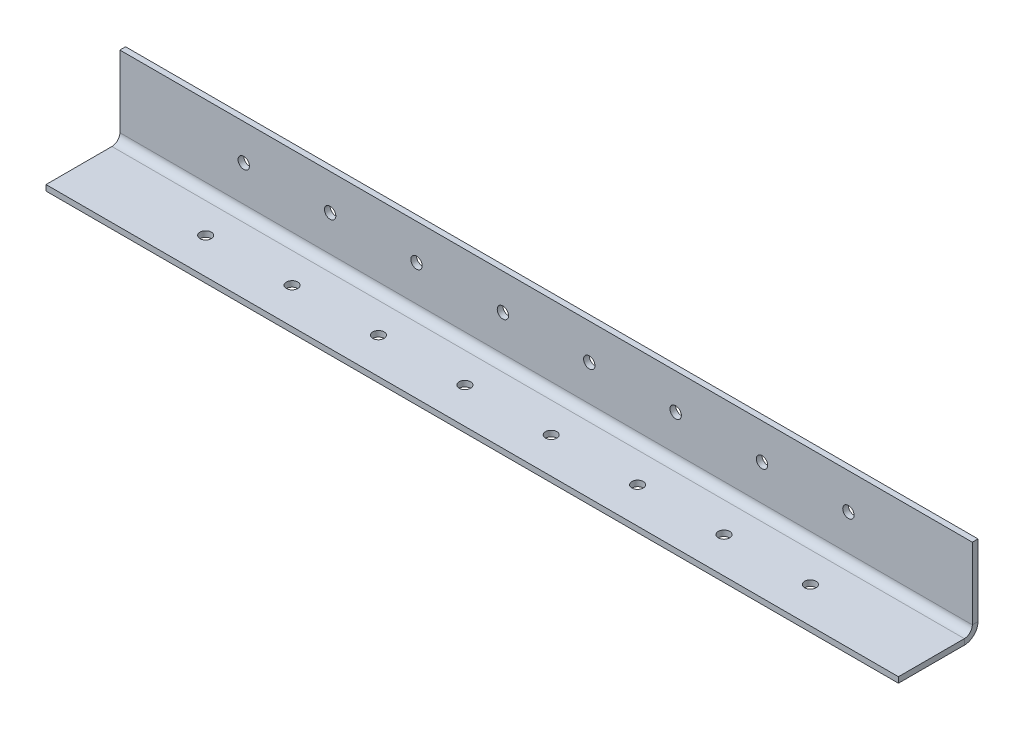
ISO-10303-21;
HEADER;
FILE_DESCRIPTION(('STEP AP214'),'2;1');
FILE_NAME('part.step','',(''),(''),'','','');
FILE_SCHEMA(('AUTOMOTIVE_DESIGN { 1 0 10303 214 1 1 1 1 }'));
ENDSEC;
DATA;
#1=APPLICATION_CONTEXT('core data for automotive mechanical design processes');
#2=APPLICATION_PROTOCOL_DEFINITION('international standard','automotive_design',2000,#1);
#3=PRODUCT_CONTEXT('',#1,'mechanical');
#4=PRODUCT('Part','Part','',(#3));
#5=PRODUCT_RELATED_PRODUCT_CATEGORY('part','',(#4));
#6=PRODUCT_DEFINITION_FORMATION('','',#4);
#7=PRODUCT_DEFINITION_CONTEXT('part definition',#1,'design');
#8=PRODUCT_DEFINITION('design','',#6,#7);
#9=PRODUCT_DEFINITION_SHAPE('','',#8);
#10=(LENGTH_UNIT() NAMED_UNIT(*) SI_UNIT(.MILLI.,.METRE.));
#11=(NAMED_UNIT(*) PLANE_ANGLE_UNIT() SI_UNIT($,.RADIAN.));
#12=(NAMED_UNIT(*) SI_UNIT($,.STERADIAN.) SOLID_ANGLE_UNIT());
#13=UNCERTAINTY_MEASURE_WITH_UNIT(LENGTH_MEASURE(1.E-05),#10,'distance_accuracy_value','');
#14=(GEOMETRIC_REPRESENTATION_CONTEXT(3) GLOBAL_UNCERTAINTY_ASSIGNED_CONTEXT((#13)) GLOBAL_UNIT_ASSIGNED_CONTEXT((#10,
#11,#12)) REPRESENTATION_CONTEXT('',''));
#15=CARTESIAN_POINT('',(0.,0.,0.));
#16=DIRECTION('',(0.,0.,1.));
#17=DIRECTION('',(1.,0.,0.));
#18=AXIS2_PLACEMENT_3D('',#15,#16,#17);
#19=CARTESIAN_POINT('',(531.999999999999,12.,0.));
#20=DIRECTION('',(0.,0.,-1.));
#21=DIRECTION('',(-1.,0.,0.));
#22=AXIS2_PLACEMENT_3D('',#19,#20,#21);
#23=CYLINDRICAL_SURFACE('',#22,10.0000000000001);
#24=CARTESIAN_POINT('',(531.999999999999,12.,0.));
#25=DIRECTION('',(0.,0.,-1.));
#26=DIRECTION('',(-1.,0.,0.));
#27=AXIS2_PLACEMENT_3D('',#24,#25,#26);
#28=CIRCLE('',#27,10.0000000000001);
#29=CARTESIAN_POINT('',(521.999999999999,12.,0.));
#30=VERTEX_POINT('',#29);
#31=EDGE_CURVE('E68',#30,#30,#28,.T.);
#32=ORIENTED_EDGE('',*,*,#31,.F.);
#33=EDGE_LOOP('',(#32));
#34=FACE_BOUND('',#33,.T.);
#35=CARTESIAN_POINT('',(531.999999999999,12.,-10.));
#36=DIRECTION('',(0.,0.,-1.));
#37=DIRECTION('',(-1.,0.,0.));
#38=AXIS2_PLACEMENT_3D('',#35,#36,#37);
#39=CIRCLE('',#38,10.0000000000001);
#40=CARTESIAN_POINT('',(521.999999999999,12.,-10.));
#41=VERTEX_POINT('',#40);
#42=EDGE_CURVE('E13',#41,#41,#39,.T.);
#43=ORIENTED_EDGE('',*,*,#42,.T.);
#44=EDGE_LOOP('',(#43));
#45=FACE_BOUND('',#44,.T.);
#46=ADVANCED_FACE('F60',(#34,#45),#23,.F.);
#47=CARTESIAN_POINT('',(379.999999999999,12.,0.));
#48=DIRECTION('',(0.,0.,-1.));
#49=DIRECTION('',(-1.,0.,0.));
#50=AXIS2_PLACEMENT_3D('',#47,#48,#49);
#51=CYLINDRICAL_SURFACE('',#50,10.0000000000001);
#52=CARTESIAN_POINT('',(379.999999999999,12.,0.));
#53=DIRECTION('',(0.,0.,-1.));
#54=DIRECTION('',(-1.,0.,0.));
#55=AXIS2_PLACEMENT_3D('',#52,#53,#54);
#56=CIRCLE('',#55,10.0000000000001);
#57=CARTESIAN_POINT('',(369.999999999999,12.,0.));
#58=VERTEX_POINT('',#57);
#59=EDGE_CURVE('E164',#58,#58,#56,.T.);
#60=ORIENTED_EDGE('',*,*,#59,.F.);
#61=EDGE_LOOP('',(#60));
#62=FACE_BOUND('',#61,.T.);
#63=CARTESIAN_POINT('',(379.999999999999,12.,-10.));
#64=DIRECTION('',(0.,0.,-1.));
#65=DIRECTION('',(-1.,0.,0.));
#66=AXIS2_PLACEMENT_3D('',#63,#64,#65);
#67=CIRCLE('',#66,10.0000000000001);
#68=CARTESIAN_POINT('',(369.999999999999,12.,-10.));
#69=VERTEX_POINT('',#68);
#70=EDGE_CURVE('E168',#69,#69,#67,.T.);
#71=ORIENTED_EDGE('',*,*,#70,.T.);
#72=EDGE_LOOP('',(#71));
#73=FACE_BOUND('',#72,.T.);
#74=ADVANCED_FACE('F179',(#62,#73),#51,.F.);
#75=CARTESIAN_POINT('',(227.999999999999,12.,0.));
#76=DIRECTION('',(0.,0.,-1.));
#77=DIRECTION('',(-1.,0.,0.));
#78=AXIS2_PLACEMENT_3D('',#75,#76,#77);
#79=CYLINDRICAL_SURFACE('',#78,10.0000000000001);
#80=CARTESIAN_POINT('',(227.999999999999,12.,0.));
#81=DIRECTION('',(0.,0.,-1.));
#82=DIRECTION('',(-1.,0.,0.));
#83=AXIS2_PLACEMENT_3D('',#80,#81,#82);
#84=CIRCLE('',#83,10.0000000000001);
#85=CARTESIAN_POINT('',(217.999999999999,12.,0.));
#86=VERTEX_POINT('',#85);
#87=EDGE_CURVE('E156',#86,#86,#84,.T.);
#88=ORIENTED_EDGE('',*,*,#87,.F.);
#89=EDGE_LOOP('',(#88));
#90=FACE_BOUND('',#89,.T.);
#91=CARTESIAN_POINT('',(227.999999999999,12.,-10.));
#92=DIRECTION('',(0.,0.,-1.));
#93=DIRECTION('',(-1.,0.,0.));
#94=AXIS2_PLACEMENT_3D('',#91,#92,#93);
#95=CIRCLE('',#94,10.0000000000001);
#96=CARTESIAN_POINT('',(217.999999999999,12.,-10.));
#97=VERTEX_POINT('',#96);
#98=EDGE_CURVE('E160',#97,#97,#95,.T.);
#99=ORIENTED_EDGE('',*,*,#98,.T.);
#100=EDGE_LOOP('',(#99));
#101=FACE_BOUND('',#100,.T.);
#102=ADVANCED_FACE('F217',(#90,#101),#79,.F.);
#103=CARTESIAN_POINT('',(75.9999999999993,12.,0.));
#104=DIRECTION('',(0.,0.,-1.));
#105=DIRECTION('',(-1.,0.,0.));
#106=AXIS2_PLACEMENT_3D('',#103,#104,#105);
#107=CYLINDRICAL_SURFACE('',#106,10.0000000000001);
#108=CARTESIAN_POINT('',(75.9999999999993,12.,0.));
#109=DIRECTION('',(0.,0.,-1.));
#110=DIRECTION('',(-1.,0.,0.));
#111=AXIS2_PLACEMENT_3D('',#108,#109,#110);
#112=CIRCLE('',#111,10.0000000000001);
#113=CARTESIAN_POINT('',(65.9999999999992,12.,0.));
#114=VERTEX_POINT('',#113);
#115=EDGE_CURVE('E148',#114,#114,#112,.T.);
#116=ORIENTED_EDGE('',*,*,#115,.F.);
#117=EDGE_LOOP('',(#116));
#118=FACE_BOUND('',#117,.T.);
#119=CARTESIAN_POINT('',(75.9999999999993,12.,-10.));
#120=DIRECTION('',(0.,0.,-1.));
#121=DIRECTION('',(-1.,0.,0.));
#122=AXIS2_PLACEMENT_3D('',#119,#120,#121);
#123=CIRCLE('',#122,10.0000000000001);
#124=CARTESIAN_POINT('',(65.9999999999992,12.,-10.));
#125=VERTEX_POINT('',#124);
#126=EDGE_CURVE('E152',#125,#125,#123,.T.);
#127=ORIENTED_EDGE('',*,*,#126,.T.);
#128=EDGE_LOOP('',(#127));
#129=FACE_BOUND('',#128,.T.);
#130=ADVANCED_FACE('F213',(#118,#129),#107,.F.);
#131=CARTESIAN_POINT('',(-76.0000000000007,12.,0.));
#132=DIRECTION('',(0.,0.,-1.));
#133=DIRECTION('',(-1.,0.,0.));
#134=AXIS2_PLACEMENT_3D('',#131,#132,#133);
#135=CYLINDRICAL_SURFACE('',#134,10.0000000000001);
#136=CARTESIAN_POINT('',(-76.0000000000007,12.,0.));
#137=DIRECTION('',(0.,0.,-1.));
#138=DIRECTION('',(-1.,0.,0.));
#139=AXIS2_PLACEMENT_3D('',#136,#137,#138);
#140=CIRCLE('',#139,10.0000000000001);
#141=CARTESIAN_POINT('',(-86.0000000000008,12.,0.));
#142=VERTEX_POINT('',#141);
#143=EDGE_CURVE('E140',#142,#142,#140,.T.);
#144=ORIENTED_EDGE('',*,*,#143,.F.);
#145=EDGE_LOOP('',(#144));
#146=FACE_BOUND('',#145,.T.);
#147=CARTESIAN_POINT('',(-76.0000000000007,12.,-10.));
#148=DIRECTION('',(0.,0.,-1.));
#149=DIRECTION('',(-1.,0.,0.));
#150=AXIS2_PLACEMENT_3D('',#147,#148,#149);
#151=CIRCLE('',#150,10.0000000000001);
#152=CARTESIAN_POINT('',(-86.0000000000008,12.,-10.));
#153=VERTEX_POINT('',#152);
#154=EDGE_CURVE('E144',#153,#153,#151,.T.);
#155=ORIENTED_EDGE('',*,*,#154,.T.);
#156=EDGE_LOOP('',(#155));
#157=FACE_BOUND('',#156,.T.);
#158=ADVANCED_FACE('F209',(#146,#157),#135,.F.);
#159=CARTESIAN_POINT('',(-228.000000000001,12.,0.));
#160=DIRECTION('',(0.,0.,-1.));
#161=DIRECTION('',(-1.,0.,0.));
#162=AXIS2_PLACEMENT_3D('',#159,#160,#161);
#163=CYLINDRICAL_SURFACE('',#162,10.0000000000001);
#164=CARTESIAN_POINT('',(-228.000000000001,12.,0.));
#165=DIRECTION('',(0.,0.,-1.));
#166=DIRECTION('',(-1.,0.,0.));
#167=AXIS2_PLACEMENT_3D('',#164,#165,#166);
#168=CIRCLE('',#167,10.0000000000001);
#169=CARTESIAN_POINT('',(-238.000000000001,12.,0.));
#170=VERTEX_POINT('',#169);
#171=EDGE_CURVE('E104',#170,#170,#168,.T.);
#172=ORIENTED_EDGE('',*,*,#171,.F.);
#173=EDGE_LOOP('',(#172));
#174=FACE_BOUND('',#173,.T.);
#175=CARTESIAN_POINT('',(-228.000000000001,12.,-10.));
#176=DIRECTION('',(0.,0.,-1.));
#177=DIRECTION('',(-1.,0.,0.));
#178=AXIS2_PLACEMENT_3D('',#175,#176,#177);
#179=CIRCLE('',#178,10.0000000000001);
#180=CARTESIAN_POINT('',(-238.000000000001,12.,-10.));
#181=VERTEX_POINT('',#180);
#182=EDGE_CURVE('E136',#181,#181,#179,.T.);
#183=ORIENTED_EDGE('',*,*,#182,.T.);
#184=EDGE_LOOP('',(#183));
#185=FACE_BOUND('',#184,.T.);
#186=ADVANCED_FACE('F193',(#174,#185),#163,.F.);
#187=CARTESIAN_POINT('',(749.999999999999,-75.,-10.));
#188=DIRECTION('',(1.,0.,0.));
#189=DIRECTION('',(0.,0.,-1.));
#190=AXIS2_PLACEMENT_3D('',#187,#188,#189);
#191=PLANE('',#190);
#192=DIRECTION('',(0.,1.,0.));
#193=VECTOR('',#192,1.);
#194=CARTESIAN_POINT('',(749.999999999999,-75.,0.));
#195=LINE('',#194,#193);
#196=CARTESIAN_POINT('',(749.999999999999,-51.0000000000001,0.));
#197=VERTEX_POINT('',#196);
#198=CARTESIAN_POINT('',(749.999999999999,75.,0.));
#199=VERTEX_POINT('',#198);
#200=EDGE_CURVE('E121',#197,#199,#195,.T.);
#201=ORIENTED_EDGE('',*,*,#200,.F.);
#202=DIRECTION('',(0.,0.,-1.));
#203=VECTOR('',#202,1.);
#204=CARTESIAN_POINT('',(749.999999999999,-51.0000000000001,0.));
#205=LINE('',#204,#203);
#206=CARTESIAN_POINT('',(749.999999999999,-51.0000000000001,-10.));
#207=VERTEX_POINT('',#206);
#208=EDGE_CURVE('E704',#197,#207,#205,.T.);
#209=ORIENTED_EDGE('',*,*,#208,.T.);
#210=DIRECTION('',(0.,1.,0.));
#211=VECTOR('',#210,1.);
#212=CARTESIAN_POINT('',(749.999999999999,-75.,-10.));
#213=LINE('',#212,#211);
#214=CARTESIAN_POINT('',(749.999999999999,75.,-10.));
#215=VERTEX_POINT('',#214);
#216=EDGE_CURVE('E116',#207,#215,#213,.T.);
#217=ORIENTED_EDGE('',*,*,#216,.T.);
#218=DIRECTION('',(0.,0.,1.));
#219=VECTOR('',#218,1.);
#220=CARTESIAN_POINT('',(749.999999999999,75.,-10.));
#221=LINE('',#220,#219);
#222=EDGE_CURVE('E105',#215,#199,#221,.T.);
#223=ORIENTED_EDGE('',*,*,#222,.T.);
#224=EDGE_LOOP('',(#201,#209,#217,#223));
#225=FACE_BOUND('',#224,.T.);
#226=ADVANCED_FACE('F184',(#225),#191,.T.);
#227=CARTESIAN_POINT('',(0.,0.,-10.));
#228=DIRECTION('',(0.,0.,-1.));
#229=DIRECTION('',(-1.,0.,0.));
#230=AXIS2_PLACEMENT_3D('',#227,#228,#229);
#231=PLANE('',#230);
#232=CARTESIAN_POINT('',(-380.000000000001,12.,-10.));
#233=DIRECTION('',(0.,0.,-1.));
#234=DIRECTION('',(-1.,0.,0.));
#235=AXIS2_PLACEMENT_3D('',#232,#233,#234);
#236=CIRCLE('',#235,10.0000000000001);
#237=CARTESIAN_POINT('',(-390.000000000001,12.,-10.));
#238=VERTEX_POINT('',#237);
#239=EDGE_CURVE('E570',#238,#238,#236,.T.);
#240=ORIENTED_EDGE('',*,*,#239,.F.);
#241=EDGE_LOOP('',(#240));
#242=FACE_BOUND('',#241,.T.);
#243=CARTESIAN_POINT('',(-532.000000000001,12.,-10.));
#244=DIRECTION('',(0.,0.,-1.));
#245=DIRECTION('',(-1.,0.,0.));
#246=AXIS2_PLACEMENT_3D('',#243,#244,#245);
#247=CIRCLE('',#246,10.0000000000001);
#248=CARTESIAN_POINT('',(-542.000000000001,12.,-10.));
#249=VERTEX_POINT('',#248);
#250=EDGE_CURVE('E586',#249,#249,#247,.T.);
#251=ORIENTED_EDGE('',*,*,#250,.F.);
#252=EDGE_LOOP('',(#251));
#253=FACE_BOUND('',#252,.T.);
#254=ORIENTED_EDGE('',*,*,#216,.F.);
#255=DIRECTION('',(1.,0.,0.));
#256=VECTOR('',#255,1.);
#257=CARTESIAN_POINT('',(749.999999999999,-51.0000000000001,-10.));
#258=LINE('',#257,#256);
#259=CARTESIAN_POINT('',(-750.000000000001,-51.,-10.));
#260=VERTEX_POINT('',#259);
#261=EDGE_CURVE('E697',#207,#260,#258,.F.);
#262=ORIENTED_EDGE('',*,*,#261,.T.);
#263=DIRECTION('',(0.,-1.,0.));
#264=VECTOR('',#263,1.);
#265=CARTESIAN_POINT('',(-750.000000000001,-75.,-10.));
#266=LINE('',#265,#264);
#267=CARTESIAN_POINT('',(-750.000000000001,75.,-10.));
#268=VERTEX_POINT('',#267);
#269=EDGE_CURVE('E132',#268,#260,#266,.T.);
#270=ORIENTED_EDGE('',*,*,#269,.F.);
#271=DIRECTION('',(-1.,0.,0.));
#272=VECTOR('',#271,1.);
#273=CARTESIAN_POINT('',(-750.000000000001,75.,-10.));
#274=LINE('',#273,#272);
#275=EDGE_CURVE('E102',#215,#268,#274,.T.);
#276=ORIENTED_EDGE('',*,*,#275,.F.);
#277=EDGE_LOOP('',(#254,#262,#270,#276));
#278=FACE_BOUND('',#277,.T.);
#279=ORIENTED_EDGE('',*,*,#182,.F.);
#280=EDGE_LOOP('',(#279));
#281=FACE_BOUND('',#280,.T.);
#282=ORIENTED_EDGE('',*,*,#154,.F.);
#283=EDGE_LOOP('',(#282));
#284=FACE_BOUND('',#283,.T.);
#285=ORIENTED_EDGE('',*,*,#126,.F.);
#286=EDGE_LOOP('',(#285));
#287=FACE_BOUND('',#286,.T.);
#288=ORIENTED_EDGE('',*,*,#98,.F.);
#289=EDGE_LOOP('',(#288));
#290=FACE_BOUND('',#289,.T.);
#291=ORIENTED_EDGE('',*,*,#70,.F.);
#292=EDGE_LOOP('',(#291));
#293=FACE_BOUND('',#292,.T.);
#294=ORIENTED_EDGE('',*,*,#42,.F.);
#295=EDGE_LOOP('',(#294));
#296=FACE_BOUND('',#295,.T.);
#297=ADVANCED_FACE('F182',(#242,#253,#278,#281,#284,#287,#290,#293,#296),#231,.T.);
#298=CARTESIAN_POINT('',(0.,0.,0.));
#299=DIRECTION('',(0.,0.,-1.));
#300=DIRECTION('',(-1.,0.,0.));
#301=AXIS2_PLACEMENT_3D('',#298,#299,#300);
#302=PLANE('',#301);
#303=CARTESIAN_POINT('',(-380.000000000001,12.,0.));
#304=DIRECTION('',(0.,0.,-1.));
#305=DIRECTION('',(-1.,0.,0.));
#306=AXIS2_PLACEMENT_3D('',#303,#304,#305);
#307=CIRCLE('',#306,10.0000000000001);
#308=CARTESIAN_POINT('',(-390.000000000001,12.,0.));
#309=VERTEX_POINT('',#308);
#310=EDGE_CURVE('E568',#309,#309,#307,.T.);
#311=ORIENTED_EDGE('',*,*,#310,.T.);
#312=EDGE_LOOP('',(#311));
#313=FACE_BOUND('',#312,.T.);
#314=CARTESIAN_POINT('',(-532.000000000001,12.,0.));
#315=DIRECTION('',(0.,0.,-1.));
#316=DIRECTION('',(-1.,0.,0.));
#317=AXIS2_PLACEMENT_3D('',#314,#315,#316);
#318=CIRCLE('',#317,10.0000000000001);
#319=CARTESIAN_POINT('',(-542.000000000001,12.,0.));
#320=VERTEX_POINT('',#319);
#321=EDGE_CURVE('E634',#320,#320,#318,.T.);
#322=ORIENTED_EDGE('',*,*,#321,.T.);
#323=EDGE_LOOP('',(#322));
#324=FACE_BOUND('',#323,.T.);
#325=DIRECTION('',(1.,0.,0.));
#326=VECTOR('',#325,1.);
#327=CARTESIAN_POINT('',(749.999999999999,-51.0000000000001,0.));
#328=LINE('',#327,#326);
#329=CARTESIAN_POINT('',(-750.000000000001,-51.0000000000001,0.));
#330=VERTEX_POINT('',#329);
#331=EDGE_CURVE('E712',#197,#330,#328,.F.);
#332=ORIENTED_EDGE('',*,*,#331,.F.);
#333=ORIENTED_EDGE('',*,*,#200,.T.);
#334=DIRECTION('',(-1.,0.,0.));
#335=VECTOR('',#334,1.);
#336=CARTESIAN_POINT('',(-750.000000000001,75.,0.));
#337=LINE('',#336,#335);
#338=CARTESIAN_POINT('',(-750.000000000001,75.,0.));
#339=VERTEX_POINT('',#338);
#340=EDGE_CURVE('E100',#199,#339,#337,.T.);
#341=ORIENTED_EDGE('',*,*,#340,.T.);
#342=DIRECTION('',(0.,-1.,0.));
#343=VECTOR('',#342,1.);
#344=CARTESIAN_POINT('',(-750.000000000001,-75.,0.));
#345=LINE('',#344,#343);
#346=EDGE_CURVE('E109',#339,#330,#345,.T.);
#347=ORIENTED_EDGE('',*,*,#346,.T.);
#348=EDGE_LOOP('',(#332,#333,#341,#347));
#349=FACE_BOUND('',#348,.T.);
#350=ORIENTED_EDGE('',*,*,#171,.T.);
#351=EDGE_LOOP('',(#350));
#352=FACE_BOUND('',#351,.T.);
#353=ORIENTED_EDGE('',*,*,#143,.T.);
#354=EDGE_LOOP('',(#353));
#355=FACE_BOUND('',#354,.T.);
#356=ORIENTED_EDGE('',*,*,#115,.T.);
#357=EDGE_LOOP('',(#356));
#358=FACE_BOUND('',#357,.T.);
#359=ORIENTED_EDGE('',*,*,#87,.T.);
#360=EDGE_LOOP('',(#359));
#361=FACE_BOUND('',#360,.T.);
#362=ORIENTED_EDGE('',*,*,#59,.T.);
#363=EDGE_LOOP('',(#362));
#364=FACE_BOUND('',#363,.T.);
#365=ORIENTED_EDGE('',*,*,#31,.T.);
#366=EDGE_LOOP('',(#365));
#367=FACE_BOUND('',#366,.T.);
#368=ADVANCED_FACE('F118',(#313,#324,#349,#352,#355,#358,#361,#364,#367),#302,.F.);
#369=CARTESIAN_POINT('',(-750.000000000001,-75.,-10.));
#370=DIRECTION('',(-1.,0.,0.));
#371=DIRECTION('',(0.,0.,1.));
#372=AXIS2_PLACEMENT_3D('',#369,#370,#371);
#373=PLANE('',#372);
#374=DIRECTION('',(0.,0.,-1.));
#375=VECTOR('',#374,1.);
#376=CARTESIAN_POINT('',(-750.000000000001,-51.0000000000001,0.));
#377=LINE('',#376,#375);
#378=EDGE_CURVE('E112',#330,#260,#377,.T.);
#379=ORIENTED_EDGE('',*,*,#378,.F.);
#380=ORIENTED_EDGE('',*,*,#346,.F.);
#381=DIRECTION('',(0.,0.,1.));
#382=VECTOR('',#381,1.);
#383=CARTESIAN_POINT('',(-750.000000000001,75.,-10.));
#384=LINE('',#383,#382);
#385=EDGE_CURVE('E84',#268,#339,#384,.T.);
#386=ORIENTED_EDGE('',*,*,#385,.F.);
#387=ORIENTED_EDGE('',*,*,#269,.T.);
#388=EDGE_LOOP('',(#379,#380,#386,#387));
#389=FACE_BOUND('',#388,.T.);
#390=ADVANCED_FACE('F110',(#389),#373,.T.);
#391=CARTESIAN_POINT('',(-750.000000000001,75.,-10.));
#392=DIRECTION('',(0.,1.,0.));
#393=DIRECTION('',(0.,0.,1.));
#394=AXIS2_PLACEMENT_3D('',#391,#392,#393);
#395=PLANE('',#394);
#396=ORIENTED_EDGE('',*,*,#340,.F.);
#397=ORIENTED_EDGE('',*,*,#222,.F.);
#398=ORIENTED_EDGE('',*,*,#275,.T.);
#399=ORIENTED_EDGE('',*,*,#385,.T.);
#400=EDGE_LOOP('',(#396,#397,#398,#399));
#401=FACE_BOUND('',#400,.T.);
#402=ADVANCED_FACE('F97',(#401),#395,.T.);
#403=CARTESIAN_POINT('',(-750.000000000001,-51.0000000000001,14.));
#404=DIRECTION('',(-1.,0.,0.));
#405=DIRECTION('',(0.,0.,1.));
#406=AXIS2_PLACEMENT_3D('',#403,#404,#405);
#407=PLANE('',#406);
#408=DIRECTION('',(0.,1.,0.));
#409=VECTOR('',#408,1.);
#410=CARTESIAN_POINT('',(-750.000000000001,-75.0000000000001,13.9999999999999));
#411=LINE('',#410,#409);
#412=CARTESIAN_POINT('',(-750.000000000001,-65.0000000000001,13.9999999999999));
#413=VERTEX_POINT('',#412);
#414=CARTESIAN_POINT('',(-750.000000000001,-75.0000000000001,13.9999999999999));
#415=VERTEX_POINT('',#414);
#416=EDGE_CURVE('E646',#413,#415,#411,.F.);
#417=ORIENTED_EDGE('',*,*,#416,.F.);
#418=CARTESIAN_POINT('',(-750.000000000001,-51.0000000000001,14.));
#419=DIRECTION('',(1.,0.,0.));
#420=DIRECTION('',(0.,0.,-1.));
#421=AXIS2_PLACEMENT_3D('',#418,#419,#420);
#422=CIRCLE('',#421,14.);
#423=EDGE_CURVE('E708',#330,#413,#422,.F.);
#424=ORIENTED_EDGE('',*,*,#423,.F.);
#425=ORIENTED_EDGE('',*,*,#378,.T.);
#426=CARTESIAN_POINT('',(-750.000000000001,-51.0000000000001,14.));
#427=DIRECTION('',(1.,0.,0.));
#428=DIRECTION('',(0.,0.,-1.));
#429=AXIS2_PLACEMENT_3D('',#426,#427,#428);
#430=CIRCLE('',#429,24.);
#431=EDGE_CURVE('E75',#260,#415,#430,.F.);
#432=ORIENTED_EDGE('',*,*,#431,.T.);
#433=EDGE_LOOP('',(#417,#424,#425,#432));
#434=FACE_BOUND('',#433,.T.);
#435=ADVANCED_FACE('F205',(#434),#407,.T.);
#436=CARTESIAN_POINT('',(749.999999999999,-51.0000000000001,14.));
#437=DIRECTION('',(-1.,0.,0.));
#438=DIRECTION('',(0.,0.,1.));
#439=AXIS2_PLACEMENT_3D('',#436,#437,#438);
#440=PLANE('',#439);
#441=CARTESIAN_POINT('',(749.999999999999,-51.0000000000001,14.));
#442=DIRECTION('',(1.,0.,0.));
#443=DIRECTION('',(0.,0.,-1.));
#444=AXIS2_PLACEMENT_3D('',#441,#442,#443);
#445=CIRCLE('',#444,14.);
#446=CARTESIAN_POINT('',(749.999999999999,-65.0000000000001,13.9999999999999));
#447=VERTEX_POINT('',#446);
#448=EDGE_CURVE('E654',#447,#197,#445,.T.);
#449=ORIENTED_EDGE('',*,*,#448,.F.);
#450=DIRECTION('',(0.,1.,0.));
#451=VECTOR('',#450,1.);
#452=CARTESIAN_POINT('',(749.999999999999,-65.0000000000001,13.9999999999999));
#453=LINE('',#452,#451);
#454=CARTESIAN_POINT('',(749.999999999999,-75.0000000000001,13.9999999999999));
#455=VERTEX_POINT('',#454);
#456=EDGE_CURVE('E686',#447,#455,#453,.F.);
#457=ORIENTED_EDGE('',*,*,#456,.T.);
#458=CARTESIAN_POINT('',(749.999999999999,-51.0000000000001,14.));
#459=DIRECTION('',(1.,0.,0.));
#460=DIRECTION('',(0.,0.,-1.));
#461=AXIS2_PLACEMENT_3D('',#458,#459,#460);
#462=CIRCLE('',#461,24.);
#463=EDGE_CURVE('E701',#455,#207,#462,.T.);
#464=ORIENTED_EDGE('',*,*,#463,.T.);
#465=ORIENTED_EDGE('',*,*,#208,.F.);
#466=EDGE_LOOP('',(#449,#457,#464,#465));
#467=FACE_BOUND('',#466,.T.);
#468=ADVANCED_FACE('F199',(#467),#440,.F.);
#469=CARTESIAN_POINT('',(749.999999999999,-51.0000000000001,14.));
#470=DIRECTION('',(1.,0.,0.));
#471=DIRECTION('',(0.,-1.,0.));
#472=AXIS2_PLACEMENT_3D('',#469,#470,#471);
#473=CYLINDRICAL_SURFACE('',#472,24.);
#474=ORIENTED_EDGE('',*,*,#261,.F.);
#475=ORIENTED_EDGE('',*,*,#463,.F.);
#476=DIRECTION('',(1.,0.,0.));
#477=VECTOR('',#476,1.);
#478=CARTESIAN_POINT('',(-750.000000000001,-75.0000000000001,13.9999999999999));
#479=LINE('',#478,#477);
#480=EDGE_CURVE('E683',#455,#415,#479,.F.);
#481=ORIENTED_EDGE('',*,*,#480,.T.);
#482=ORIENTED_EDGE('',*,*,#431,.F.);
#483=EDGE_LOOP('',(#474,#475,#481,#482));
#484=FACE_BOUND('',#483,.T.);
#485=ADVANCED_FACE('F292',(#484),#473,.T.);
#486=CARTESIAN_POINT('',(749.999999999999,-51.0000000000001,14.));
#487=DIRECTION('',(1.,0.,0.));
#488=DIRECTION('',(0.,-1.,0.));
#489=AXIS2_PLACEMENT_3D('',#486,#487,#488);
#490=CYLINDRICAL_SURFACE('',#489,14.);
#491=ORIENTED_EDGE('',*,*,#331,.T.);
#492=ORIENTED_EDGE('',*,*,#423,.T.);
#493=DIRECTION('',(1.,0.,0.));
#494=VECTOR('',#493,1.);
#495=CARTESIAN_POINT('',(-750.000000000001,-65.0000000000001,14.));
#496=LINE('',#495,#494);
#497=EDGE_CURVE('E690',#413,#447,#496,.T.);
#498=ORIENTED_EDGE('',*,*,#497,.T.);
#499=ORIENTED_EDGE('',*,*,#448,.T.);
#500=EDGE_LOOP('',(#491,#492,#498,#499));
#501=FACE_BOUND('',#500,.T.);
#502=ADVANCED_FACE('F301',(#501),#490,.F.);
#503=CARTESIAN_POINT('',(-750.000000000001,-75.,0.));
#504=DIRECTION('',(1.,0.,0.));
#505=DIRECTION('',(0.,0.,-1.));
#506=AXIS2_PLACEMENT_3D('',#503,#504,#505);
#507=PLANE('',#506);
#508=ORIENTED_EDGE('',*,*,#416,.T.);
#509=DIRECTION('',(0.,0.,-1.));
#510=VECTOR('',#509,1.);
#511=CARTESIAN_POINT('',(-750.000000000001,-75.,-2.99126542806437E-13));
#512=LINE('',#511,#510);
#513=CARTESIAN_POINT('',(-750.000000000001,-75.0000000000005,130.));
#514=VERTEX_POINT('',#513);
#515=EDGE_CURVE('E667',#514,#415,#512,.T.);
#516=ORIENTED_EDGE('',*,*,#515,.F.);
#517=DIRECTION('',(0.,1.,0.));
#518=VECTOR('',#517,1.);
#519=CARTESIAN_POINT('',(-750.000000000001,-75.0000000000005,130.));
#520=LINE('',#519,#518);
#521=CARTESIAN_POINT('',(-750.000000000001,-65.0000000000005,130.));
#522=VERTEX_POINT('',#521);
#523=EDGE_CURVE('E655',#514,#522,#520,.T.);
#524=ORIENTED_EDGE('',*,*,#523,.T.);
#525=DIRECTION('',(0.,0.,1.));
#526=VECTOR('',#525,1.);
#527=CARTESIAN_POINT('',(-750.000000000001,-65.,0.));
#528=LINE('',#527,#526);
#529=EDGE_CURVE('E679',#522,#413,#528,.F.);
#530=ORIENTED_EDGE('',*,*,#529,.T.);
#531=EDGE_LOOP('',(#508,#516,#524,#530));
#532=FACE_BOUND('',#531,.T.);
#533=ADVANCED_FACE('F310',(#532),#507,.F.);
#534=CARTESIAN_POINT('',(749.999999999999,-75.0000000000005,130.));
#535=DIRECTION('',(-1.,0.,0.));
#536=DIRECTION('',(0.,0.,1.));
#537=AXIS2_PLACEMENT_3D('',#534,#535,#536);
#538=PLANE('',#537);
#539=ORIENTED_EDGE('',*,*,#456,.F.);
#540=DIRECTION('',(0.,0.,-1.));
#541=VECTOR('',#540,1.);
#542=CARTESIAN_POINT('',(749.999999999999,-65.0000000000005,130.));
#543=LINE('',#542,#541);
#544=CARTESIAN_POINT('',(749.999999999999,-65.0000000000005,130.));
#545=VERTEX_POINT('',#544);
#546=EDGE_CURVE('E675',#447,#545,#543,.F.);
#547=ORIENTED_EDGE('',*,*,#546,.T.);
#548=DIRECTION('',(0.,1.,0.));
#549=VECTOR('',#548,1.);
#550=CARTESIAN_POINT('',(749.999999999999,-75.0000000000005,130.));
#551=LINE('',#550,#549);
#552=CARTESIAN_POINT('',(749.999999999999,-75.0000000000005,130.));
#553=VERTEX_POINT('',#552);
#554=EDGE_CURVE('E650',#553,#545,#551,.T.);
#555=ORIENTED_EDGE('',*,*,#554,.F.);
#556=DIRECTION('',(0.,0.,1.));
#557=VECTOR('',#556,1.);
#558=CARTESIAN_POINT('',(749.999999999999,-75.,-2.99126542806437E-13));
#559=LINE('',#558,#557);
#560=EDGE_CURVE('E663',#455,#553,#559,.T.);
#561=ORIENTED_EDGE('',*,*,#560,.F.);
#562=EDGE_LOOP('',(#539,#547,#555,#561));
#563=FACE_BOUND('',#562,.T.);
#564=ADVANCED_FACE('F320',(#563),#538,.F.);
#565=CARTESIAN_POINT('',(0.,-75.,-2.99126542806437E-13));
#566=DIRECTION('',(0.,1.,0.));
#567=DIRECTION('',(0.,0.,1.));
#568=AXIS2_PLACEMENT_3D('',#565,#566,#567);
#569=PLANE('',#568);
#570=CARTESIAN_POINT('',(-380.000000000001,-75.0000000000002,67.));
#571=DIRECTION('',(0.,-1.,0.));
#572=DIRECTION('',(0.,0.,-1.));
#573=AXIS2_PLACEMENT_3D('',#570,#571,#572);
#574=CIRCLE('',#573,10.0000000000001);
#575=CARTESIAN_POINT('',(-380.000000000001,-75.0000000000002,56.9999999999999));
#576=VERTEX_POINT('',#575);
#577=EDGE_CURVE('E587',#576,#576,#574,.T.);
#578=ORIENTED_EDGE('',*,*,#577,.F.);
#579=EDGE_LOOP('',(#578));
#580=FACE_BOUND('',#579,.T.);
#581=CARTESIAN_POINT('',(-228.000000000001,-75.0000000000002,67.));
#582=DIRECTION('',(0.,-1.,0.));
#583=DIRECTION('',(0.,0.,-1.));
#584=AXIS2_PLACEMENT_3D('',#581,#582,#583);
#585=CIRCLE('',#584,10.0000000000001);
#586=CARTESIAN_POINT('',(-228.000000000001,-75.0000000000002,56.9999999999999));
#587=VERTEX_POINT('',#586);
#588=EDGE_CURVE('E595',#587,#587,#585,.T.);
#589=ORIENTED_EDGE('',*,*,#588,.F.);
#590=EDGE_LOOP('',(#589));
#591=FACE_BOUND('',#590,.T.);
#592=CARTESIAN_POINT('',(-76.0000000000007,-75.0000000000002,67.));
#593=DIRECTION('',(0.,-1.,0.));
#594=DIRECTION('',(0.,0.,-1.));
#595=AXIS2_PLACEMENT_3D('',#592,#593,#594);
#596=CIRCLE('',#595,10.0000000000001);
#597=CARTESIAN_POINT('',(-76.0000000000007,-75.0000000000002,56.9999999999999));
#598=VERTEX_POINT('',#597);
#599=EDGE_CURVE('E603',#598,#598,#596,.T.);
#600=ORIENTED_EDGE('',*,*,#599,.F.);
#601=EDGE_LOOP('',(#600));
#602=FACE_BOUND('',#601,.T.);
#603=CARTESIAN_POINT('',(75.9999999999993,-75.0000000000002,67.));
#604=DIRECTION('',(0.,-1.,0.));
#605=DIRECTION('',(0.,0.,-1.));
#606=AXIS2_PLACEMENT_3D('',#603,#604,#605);
#607=CIRCLE('',#606,10.0000000000001);
#608=CARTESIAN_POINT('',(75.9999999999993,-75.0000000000002,56.9999999999999));
#609=VERTEX_POINT('',#608);
#610=EDGE_CURVE('E611',#609,#609,#607,.T.);
#611=ORIENTED_EDGE('',*,*,#610,.F.);
#612=EDGE_LOOP('',(#611));
#613=FACE_BOUND('',#612,.T.);
#614=CARTESIAN_POINT('',(227.999999999999,-75.0000000000002,67.));
#615=DIRECTION('',(0.,-1.,0.));
#616=DIRECTION('',(0.,0.,-1.));
#617=AXIS2_PLACEMENT_3D('',#614,#615,#616);
#618=CIRCLE('',#617,10.0000000000001);
#619=CARTESIAN_POINT('',(227.999999999999,-75.0000000000002,56.9999999999999));
#620=VERTEX_POINT('',#619);
#621=EDGE_CURVE('E619',#620,#620,#618,.T.);
#622=ORIENTED_EDGE('',*,*,#621,.F.);
#623=EDGE_LOOP('',(#622));
#624=FACE_BOUND('',#623,.T.);
#625=CARTESIAN_POINT('',(379.999999999999,-75.0000000000002,67.));
#626=DIRECTION('',(0.,-1.,0.));
#627=DIRECTION('',(0.,0.,-1.));
#628=AXIS2_PLACEMENT_3D('',#625,#626,#627);
#629=CIRCLE('',#628,10.0000000000001);
#630=CARTESIAN_POINT('',(379.999999999999,-75.0000000000002,56.9999999999999));
#631=VERTEX_POINT('',#630);
#632=EDGE_CURVE('E627',#631,#631,#629,.T.);
#633=ORIENTED_EDGE('',*,*,#632,.F.);
#634=EDGE_LOOP('',(#633));
#635=FACE_BOUND('',#634,.T.);
#636=CARTESIAN_POINT('',(531.999999999999,-75.0000000000002,67.));
#637=DIRECTION('',(0.,-1.,0.));
#638=DIRECTION('',(0.,0.,-1.));
#639=AXIS2_PLACEMENT_3D('',#636,#637,#638);
#640=CIRCLE('',#639,10.0000000000001);
#641=CARTESIAN_POINT('',(531.999999999999,-75.0000000000002,56.9999999999999));
#642=VERTEX_POINT('',#641);
#643=EDGE_CURVE('E572',#642,#642,#640,.T.);
#644=ORIENTED_EDGE('',*,*,#643,.F.);
#645=EDGE_LOOP('',(#644));
#646=FACE_BOUND('',#645,.T.);
#647=CARTESIAN_POINT('',(-532.000000000001,-75.0000000000002,67.));
#648=DIRECTION('',(0.,-1.,0.));
#649=DIRECTION('',(0.,0.,-1.));
#650=AXIS2_PLACEMENT_3D('',#647,#648,#649);
#651=CIRCLE('',#650,10.0000000000001);
#652=CARTESIAN_POINT('',(-532.000000000001,-75.0000000000002,56.9999999999999));
#653=VERTEX_POINT('',#652);
#654=EDGE_CURVE('E638',#653,#653,#651,.T.);
#655=ORIENTED_EDGE('',*,*,#654,.F.);
#656=EDGE_LOOP('',(#655));
#657=FACE_BOUND('',#656,.T.);
#658=ORIENTED_EDGE('',*,*,#480,.F.);
#659=ORIENTED_EDGE('',*,*,#560,.T.);
#660=DIRECTION('',(-1.,0.,0.));
#661=VECTOR('',#660,1.);
#662=CARTESIAN_POINT('',(0.,-75.0000000000005,130.));
#663=LINE('',#662,#661);
#664=EDGE_CURVE('E659',#553,#514,#663,.T.);
#665=ORIENTED_EDGE('',*,*,#664,.T.);
#666=ORIENTED_EDGE('',*,*,#515,.T.);
#667=EDGE_LOOP('',(#658,#659,#665,#666));
#668=FACE_BOUND('',#667,.T.);
#669=ADVANCED_FACE('F330',(#580,#591,#602,#613,#624,#635,#646,#657,#668),#569,.F.);
#670=CARTESIAN_POINT('',(0.,-65.,-2.64211729418006E-13));
#671=DIRECTION('',(0.,1.,0.));
#672=DIRECTION('',(0.,0.,1.));
#673=AXIS2_PLACEMENT_3D('',#670,#671,#672);
#674=PLANE('',#673);
#675=CARTESIAN_POINT('',(-380.000000000001,-65.0000000000003,67.));
#676=DIRECTION('',(0.,-1.,0.));
#677=DIRECTION('',(0.,0.,-1.));
#678=AXIS2_PLACEMENT_3D('',#675,#676,#677);
#679=CIRCLE('',#678,10.0000000000001);
#680=CARTESIAN_POINT('',(-380.000000000001,-65.0000000000002,56.9999999999999));
#681=VERTEX_POINT('',#680);
#682=EDGE_CURVE('E582',#681,#681,#679,.T.);
#683=ORIENTED_EDGE('',*,*,#682,.T.);
#684=EDGE_LOOP('',(#683));
#685=FACE_BOUND('',#684,.T.);
#686=CARTESIAN_POINT('',(-228.000000000001,-65.0000000000003,67.));
#687=DIRECTION('',(0.,-1.,0.));
#688=DIRECTION('',(0.,0.,-1.));
#689=AXIS2_PLACEMENT_3D('',#686,#687,#688);
#690=CIRCLE('',#689,10.0000000000001);
#691=CARTESIAN_POINT('',(-228.000000000001,-65.0000000000002,56.9999999999999));
#692=VERTEX_POINT('',#691);
#693=EDGE_CURVE('E591',#692,#692,#690,.T.);
#694=ORIENTED_EDGE('',*,*,#693,.T.);
#695=EDGE_LOOP('',(#694));
#696=FACE_BOUND('',#695,.T.);
#697=CARTESIAN_POINT('',(-76.0000000000007,-65.0000000000003,67.));
#698=DIRECTION('',(0.,-1.,0.));
#699=DIRECTION('',(0.,0.,-1.));
#700=AXIS2_PLACEMENT_3D('',#697,#698,#699);
#701=CIRCLE('',#700,10.0000000000001);
#702=CARTESIAN_POINT('',(-76.0000000000007,-65.0000000000002,56.9999999999999));
#703=VERTEX_POINT('',#702);
#704=EDGE_CURVE('E599',#703,#703,#701,.T.);
#705=ORIENTED_EDGE('',*,*,#704,.T.);
#706=EDGE_LOOP('',(#705));
#707=FACE_BOUND('',#706,.T.);
#708=CARTESIAN_POINT('',(75.9999999999993,-65.0000000000003,67.));
#709=DIRECTION('',(0.,-1.,0.));
#710=DIRECTION('',(0.,0.,-1.));
#711=AXIS2_PLACEMENT_3D('',#708,#709,#710);
#712=CIRCLE('',#711,10.0000000000001);
#713=CARTESIAN_POINT('',(75.9999999999993,-65.0000000000002,56.9999999999999));
#714=VERTEX_POINT('',#713);
#715=EDGE_CURVE('E607',#714,#714,#712,.T.);
#716=ORIENTED_EDGE('',*,*,#715,.T.);
#717=EDGE_LOOP('',(#716));
#718=FACE_BOUND('',#717,.T.);
#719=CARTESIAN_POINT('',(227.999999999999,-65.0000000000003,67.));
#720=DIRECTION('',(0.,-1.,0.));
#721=DIRECTION('',(0.,0.,-1.));
#722=AXIS2_PLACEMENT_3D('',#719,#720,#721);
#723=CIRCLE('',#722,10.0000000000001);
#724=CARTESIAN_POINT('',(227.999999999999,-65.0000000000002,56.9999999999999));
#725=VERTEX_POINT('',#724);
#726=EDGE_CURVE('E615',#725,#725,#723,.T.);
#727=ORIENTED_EDGE('',*,*,#726,.T.);
#728=EDGE_LOOP('',(#727));
#729=FACE_BOUND('',#728,.T.);
#730=CARTESIAN_POINT('',(379.999999999999,-65.0000000000003,67.));
#731=DIRECTION('',(0.,-1.,0.));
#732=DIRECTION('',(0.,0.,-1.));
#733=AXIS2_PLACEMENT_3D('',#730,#731,#732);
#734=CIRCLE('',#733,10.0000000000001);
#735=CARTESIAN_POINT('',(379.999999999999,-65.0000000000002,56.9999999999999));
#736=VERTEX_POINT('',#735);
#737=EDGE_CURVE('E623',#736,#736,#734,.T.);
#738=ORIENTED_EDGE('',*,*,#737,.T.);
#739=EDGE_LOOP('',(#738));
#740=FACE_BOUND('',#739,.T.);
#741=CARTESIAN_POINT('',(531.999999999999,-65.0000000000003,67.));
#742=DIRECTION('',(0.,-1.,0.));
#743=DIRECTION('',(0.,0.,-1.));
#744=AXIS2_PLACEMENT_3D('',#741,#742,#743);
#745=CIRCLE('',#744,10.0000000000001);
#746=CARTESIAN_POINT('',(531.999999999999,-65.0000000000002,56.9999999999999));
#747=VERTEX_POINT('',#746);
#748=EDGE_CURVE('E578',#747,#747,#745,.T.);
#749=ORIENTED_EDGE('',*,*,#748,.T.);
#750=EDGE_LOOP('',(#749));
#751=FACE_BOUND('',#750,.T.);
#752=CARTESIAN_POINT('',(-532.000000000001,-65.0000000000003,67.));
#753=DIRECTION('',(0.,-1.,0.));
#754=DIRECTION('',(0.,0.,-1.));
#755=AXIS2_PLACEMENT_3D('',#752,#753,#754);
#756=CIRCLE('',#755,10.0000000000001);
#757=CARTESIAN_POINT('',(-532.000000000001,-65.0000000000002,56.9999999999999));
#758=VERTEX_POINT('',#757);
#759=EDGE_CURVE('E642',#758,#758,#756,.T.);
#760=ORIENTED_EDGE('',*,*,#759,.T.);
#761=EDGE_LOOP('',(#760));
#762=FACE_BOUND('',#761,.T.);
#763=ORIENTED_EDGE('',*,*,#546,.F.);
#764=ORIENTED_EDGE('',*,*,#497,.F.);
#765=ORIENTED_EDGE('',*,*,#529,.F.);
#766=DIRECTION('',(1.,0.,0.));
#767=VECTOR('',#766,1.);
#768=CARTESIAN_POINT('',(-750.000000000001,-65.0000000000005,130.));
#769=LINE('',#768,#767);
#770=EDGE_CURVE('E671',#545,#522,#769,.F.);
#771=ORIENTED_EDGE('',*,*,#770,.F.);
#772=EDGE_LOOP('',(#763,#764,#765,#771));
#773=FACE_BOUND('',#772,.T.);
#774=ADVANCED_FACE('F340',(#685,#696,#707,#718,#729,#740,#751,#762,#773),#674,.T.);
#775=CARTESIAN_POINT('',(-750.000000000001,-75.0000000000005,130.));
#776=DIRECTION('',(0.,0.,-1.));
#777=DIRECTION('',(0.,1.,0.));
#778=AXIS2_PLACEMENT_3D('',#775,#776,#777);
#779=PLANE('',#778);
#780=ORIENTED_EDGE('',*,*,#770,.T.);
#781=ORIENTED_EDGE('',*,*,#523,.F.);
#782=ORIENTED_EDGE('',*,*,#664,.F.);
#783=ORIENTED_EDGE('',*,*,#554,.T.);
#784=EDGE_LOOP('',(#780,#781,#782,#783));
#785=FACE_BOUND('',#784,.T.);
#786=ADVANCED_FACE('F350',(#785),#779,.F.);
#787=CARTESIAN_POINT('',(-532.000000000001,-65.0000000000003,67.));
#788=DIRECTION('',(0.,-1.,0.));
#789=DIRECTION('',(0.,0.,-1.));
#790=AXIS2_PLACEMENT_3D('',#787,#788,#789);
#791=CYLINDRICAL_SURFACE('',#790,10.0000000000001);
#792=ORIENTED_EDGE('',*,*,#759,.F.);
#793=EDGE_LOOP('',(#792));
#794=FACE_BOUND('',#793,.T.);
#795=ORIENTED_EDGE('',*,*,#654,.T.);
#796=EDGE_LOOP('',(#795));
#797=FACE_BOUND('',#796,.T.);
#798=ADVANCED_FACE('F360',(#794,#797),#791,.F.);
#799=CARTESIAN_POINT('',(-532.000000000001,12.,0.));
#800=DIRECTION('',(0.,0.,-1.));
#801=DIRECTION('',(-1.,0.,0.));
#802=AXIS2_PLACEMENT_3D('',#799,#800,#801);
#803=CYLINDRICAL_SURFACE('',#802,10.0000000000001);
#804=ORIENTED_EDGE('',*,*,#321,.F.);
#805=EDGE_LOOP('',(#804));
#806=FACE_BOUND('',#805,.T.);
#807=ORIENTED_EDGE('',*,*,#250,.T.);
#808=EDGE_LOOP('',(#807));
#809=FACE_BOUND('',#808,.T.);
#810=ADVANCED_FACE('F370',(#806,#809),#803,.F.);
#811=CARTESIAN_POINT('',(531.999999999999,-65.0000000000003,67.));
#812=DIRECTION('',(0.,-1.,0.));
#813=DIRECTION('',(0.,0.,-1.));
#814=AXIS2_PLACEMENT_3D('',#811,#812,#813);
#815=CYLINDRICAL_SURFACE('',#814,10.0000000000001);
#816=ORIENTED_EDGE('',*,*,#748,.F.);
#817=EDGE_LOOP('',(#816));
#818=FACE_BOUND('',#817,.T.);
#819=ORIENTED_EDGE('',*,*,#643,.T.);
#820=EDGE_LOOP('',(#819));
#821=FACE_BOUND('',#820,.T.);
#822=ADVANCED_FACE('F380',(#818,#821),#815,.F.);
#823=CARTESIAN_POINT('',(379.999999999999,-65.0000000000003,67.));
#824=DIRECTION('',(0.,-1.,0.));
#825=DIRECTION('',(0.,0.,-1.));
#826=AXIS2_PLACEMENT_3D('',#823,#824,#825);
#827=CYLINDRICAL_SURFACE('',#826,10.0000000000001);
#828=ORIENTED_EDGE('',*,*,#737,.F.);
#829=EDGE_LOOP('',(#828));
#830=FACE_BOUND('',#829,.T.);
#831=ORIENTED_EDGE('',*,*,#632,.T.);
#832=EDGE_LOOP('',(#831));
#833=FACE_BOUND('',#832,.T.);
#834=ADVANCED_FACE('F390',(#830,#833),#827,.F.);
#835=CARTESIAN_POINT('',(227.999999999999,-65.0000000000003,67.));
#836=DIRECTION('',(0.,-1.,0.));
#837=DIRECTION('',(0.,0.,-1.));
#838=AXIS2_PLACEMENT_3D('',#835,#836,#837);
#839=CYLINDRICAL_SURFACE('',#838,10.0000000000001);
#840=ORIENTED_EDGE('',*,*,#726,.F.);
#841=EDGE_LOOP('',(#840));
#842=FACE_BOUND('',#841,.T.);
#843=ORIENTED_EDGE('',*,*,#621,.T.);
#844=EDGE_LOOP('',(#843));
#845=FACE_BOUND('',#844,.T.);
#846=ADVANCED_FACE('F400',(#842,#845),#839,.F.);
#847=CARTESIAN_POINT('',(75.9999999999993,-65.0000000000003,67.));
#848=DIRECTION('',(0.,-1.,0.));
#849=DIRECTION('',(0.,0.,-1.));
#850=AXIS2_PLACEMENT_3D('',#847,#848,#849);
#851=CYLINDRICAL_SURFACE('',#850,10.0000000000001);
#852=ORIENTED_EDGE('',*,*,#715,.F.);
#853=EDGE_LOOP('',(#852));
#854=FACE_BOUND('',#853,.T.);
#855=ORIENTED_EDGE('',*,*,#610,.T.);
#856=EDGE_LOOP('',(#855));
#857=FACE_BOUND('',#856,.T.);
#858=ADVANCED_FACE('F410',(#854,#857),#851,.F.);
#859=CARTESIAN_POINT('',(-76.0000000000007,-65.0000000000003,67.));
#860=DIRECTION('',(0.,-1.,0.));
#861=DIRECTION('',(0.,0.,-1.));
#862=AXIS2_PLACEMENT_3D('',#859,#860,#861);
#863=CYLINDRICAL_SURFACE('',#862,10.0000000000001);
#864=ORIENTED_EDGE('',*,*,#704,.F.);
#865=EDGE_LOOP('',(#864));
#866=FACE_BOUND('',#865,.T.);
#867=ORIENTED_EDGE('',*,*,#599,.T.);
#868=EDGE_LOOP('',(#867));
#869=FACE_BOUND('',#868,.T.);
#870=ADVANCED_FACE('F420',(#866,#869),#863,.F.);
#871=CARTESIAN_POINT('',(-228.000000000001,-65.0000000000003,67.));
#872=DIRECTION('',(0.,-1.,0.));
#873=DIRECTION('',(0.,0.,-1.));
#874=AXIS2_PLACEMENT_3D('',#871,#872,#873);
#875=CYLINDRICAL_SURFACE('',#874,10.0000000000001);
#876=ORIENTED_EDGE('',*,*,#693,.F.);
#877=EDGE_LOOP('',(#876));
#878=FACE_BOUND('',#877,.T.);
#879=ORIENTED_EDGE('',*,*,#588,.T.);
#880=EDGE_LOOP('',(#879));
#881=FACE_BOUND('',#880,.T.);
#882=ADVANCED_FACE('F430',(#878,#881),#875,.F.);
#883=CARTESIAN_POINT('',(-380.000000000001,-65.0000000000003,67.));
#884=DIRECTION('',(0.,-1.,0.));
#885=DIRECTION('',(0.,0.,-1.));
#886=AXIS2_PLACEMENT_3D('',#883,#884,#885);
#887=CYLINDRICAL_SURFACE('',#886,10.0000000000001);
#888=ORIENTED_EDGE('',*,*,#682,.F.);
#889=EDGE_LOOP('',(#888));
#890=FACE_BOUND('',#889,.T.);
#891=ORIENTED_EDGE('',*,*,#577,.T.);
#892=EDGE_LOOP('',(#891));
#893=FACE_BOUND('',#892,.T.);
#894=ADVANCED_FACE('F440',(#890,#893),#887,.F.);
#895=CARTESIAN_POINT('',(-380.000000000001,12.,0.));
#896=DIRECTION('',(0.,0.,-1.));
#897=DIRECTION('',(-1.,0.,0.));
#898=AXIS2_PLACEMENT_3D('',#895,#896,#897);
#899=CYLINDRICAL_SURFACE('',#898,10.0000000000001);
#900=ORIENTED_EDGE('',*,*,#310,.F.);
#901=EDGE_LOOP('',(#900));
#902=FACE_BOUND('',#901,.T.);
#903=ORIENTED_EDGE('',*,*,#239,.T.);
#904=EDGE_LOOP('',(#903));
#905=FACE_BOUND('',#904,.T.);
#906=ADVANCED_FACE('F450',(#902,#905),#899,.F.);
#907=CLOSED_SHELL('',(#46,#74,#102,#130,#158,#186,#226,#297,#368,#390,#402,#435,#468,#485,#502,
#533,#564,#669,#774,#786,#798,#810,#822,#834,#846,#858,#870,#882,#894,#906));
#908=MANIFOLD_SOLID_BREP('B2',#907);
#909=ADVANCED_BREP_SHAPE_REPRESENTATION('',(#18,#908),#14);
#910=SHAPE_DEFINITION_REPRESENTATION(#9,#909);
ENDSEC;
END-ISO-10303-21;
